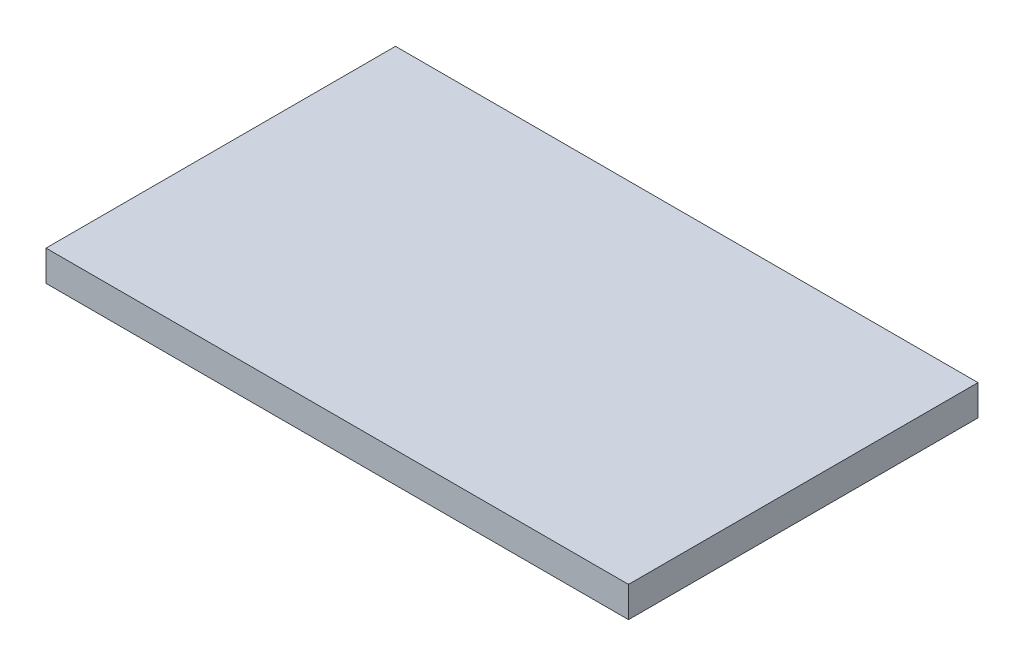
ISO-10303-21;
HEADER;
FILE_DESCRIPTION(('STEP AP214'),'2;1');
FILE_NAME('part.step','',(''),(''),'','','');
FILE_SCHEMA(('AUTOMOTIVE_DESIGN { 1 0 10303 214 1 1 1 1 }'));
ENDSEC;
DATA;
#1=APPLICATION_CONTEXT('core data for automotive mechanical design processes');
#2=APPLICATION_PROTOCOL_DEFINITION('international standard','automotive_design',2000,#1);
#3=PRODUCT_CONTEXT('',#1,'mechanical');
#4=PRODUCT('Part','Part','',(#3));
#5=PRODUCT_RELATED_PRODUCT_CATEGORY('part','',(#4));
#6=PRODUCT_DEFINITION_FORMATION('','',#4);
#7=PRODUCT_DEFINITION_CONTEXT('part definition',#1,'design');
#8=PRODUCT_DEFINITION('design','',#6,#7);
#9=PRODUCT_DEFINITION_SHAPE('','',#8);
#10=(LENGTH_UNIT() NAMED_UNIT(*) SI_UNIT(.MILLI.,.METRE.));
#11=(NAMED_UNIT(*) PLANE_ANGLE_UNIT() SI_UNIT($,.RADIAN.));
#12=(NAMED_UNIT(*) SI_UNIT($,.STERADIAN.) SOLID_ANGLE_UNIT());
#13=UNCERTAINTY_MEASURE_WITH_UNIT(LENGTH_MEASURE(1.E-05),#10,'distance_accuracy_value','');
#14=(GEOMETRIC_REPRESENTATION_CONTEXT(3) GLOBAL_UNCERTAINTY_ASSIGNED_CONTEXT((#13)) GLOBAL_UNIT_ASSIGNED_CONTEXT((#10,
#11,#12)) REPRESENTATION_CONTEXT('',''));
#15=CARTESIAN_POINT('',(0.,0.,0.));
#16=DIRECTION('',(0.,0.,1.));
#17=DIRECTION('',(1.,0.,0.));
#18=AXIS2_PLACEMENT_3D('',#15,#16,#17);
#19=CARTESIAN_POINT('',(0.,2.,0.));
#20=DIRECTION('',(-1.,0.,0.));
#21=DIRECTION('',(0.,0.,1.));
#22=AXIS2_PLACEMENT_3D('',#19,#20,#21);
#23=PLANE('',#22);
#24=DIRECTION('',(0.,0.,-1.));
#25=VECTOR('',#24,1.);
#26=CARTESIAN_POINT('',(0.,0.,0.));
#27=LINE('',#26,#25);
#28=CARTESIAN_POINT('',(0.,0.,0.));
#29=VERTEX_POINT('',#28);
#30=CARTESIAN_POINT('',(0.,0.,-22.86));
#31=VERTEX_POINT('',#30);
#32=EDGE_CURVE('E95',#29,#31,#27,.T.);
#33=ORIENTED_EDGE('',*,*,#32,.T.);
#34=DIRECTION('',(0.,-1.,0.));
#35=VECTOR('',#34,1.);
#36=CARTESIAN_POINT('',(0.,2.,-22.86));
#37=LINE('',#36,#35);
#38=CARTESIAN_POINT('',(0.,2.,-22.86));
#39=VERTEX_POINT('',#38);
#40=EDGE_CURVE('E11',#39,#31,#37,.T.);
#41=ORIENTED_EDGE('',*,*,#40,.F.);
#42=DIRECTION('',(0.,0.,-1.));
#43=VECTOR('',#42,1.);
#44=CARTESIAN_POINT('',(0.,2.,0.));
#45=LINE('',#44,#43);
#46=CARTESIAN_POINT('',(0.,2.,0.));
#47=VERTEX_POINT('',#46);
#48=EDGE_CURVE('E83',#47,#39,#45,.T.);
#49=ORIENTED_EDGE('',*,*,#48,.F.);
#50=DIRECTION('',(0.,-1.,0.));
#51=VECTOR('',#50,1.);
#52=CARTESIAN_POINT('',(0.,2.,0.));
#53=LINE('',#52,#51);
#54=EDGE_CURVE('E91',#47,#29,#53,.T.);
#55=ORIENTED_EDGE('',*,*,#54,.T.);
#56=EDGE_LOOP('',(#33,#41,#49,#55));
#57=FACE_BOUND('',#56,.T.);
#58=ADVANCED_FACE('F32',(#57),#23,.F.);
#59=CARTESIAN_POINT('',(0.,2.,-22.86));
#60=DIRECTION('',(0.,0.,1.));
#61=DIRECTION('',(1.,0.,0.));
#62=AXIS2_PLACEMENT_3D('',#59,#60,#61);
#63=PLANE('',#62);
#64=DIRECTION('',(-1.,0.,0.));
#65=VECTOR('',#64,1.);
#66=CARTESIAN_POINT('',(0.,0.,-22.86));
#67=LINE('',#66,#65);
#68=CARTESIAN_POINT('',(-38.1,0.,-22.86));
#69=VERTEX_POINT('',#68);
#70=EDGE_CURVE('E87',#31,#69,#67,.T.);
#71=ORIENTED_EDGE('',*,*,#70,.T.);
#72=DIRECTION('',(0.,-1.,0.));
#73=VECTOR('',#72,1.);
#74=CARTESIAN_POINT('',(-38.1,2.,-22.86));
#75=LINE('',#74,#73);
#76=CARTESIAN_POINT('',(-38.1,2.,-22.86));
#77=VERTEX_POINT('',#76);
#78=EDGE_CURVE('E40',#77,#69,#75,.T.);
#79=ORIENTED_EDGE('',*,*,#78,.F.);
#80=DIRECTION('',(-1.,0.,0.));
#81=VECTOR('',#80,1.);
#82=CARTESIAN_POINT('',(0.,2.,-22.86));
#83=LINE('',#82,#81);
#84=EDGE_CURVE('E78',#39,#77,#83,.T.);
#85=ORIENTED_EDGE('',*,*,#84,.F.);
#86=ORIENTED_EDGE('',*,*,#40,.T.);
#87=EDGE_LOOP('',(#71,#79,#85,#86));
#88=FACE_BOUND('',#87,.T.);
#89=ADVANCED_FACE('F86',(#88),#63,.F.);
#90=CARTESIAN_POINT('',(-38.1,2.,0.));
#91=DIRECTION('',(1.,0.,0.));
#92=DIRECTION('',(0.,0.,-1.));
#93=AXIS2_PLACEMENT_3D('',#90,#91,#92);
#94=PLANE('',#93);
#95=DIRECTION('',(0.,0.,1.));
#96=VECTOR('',#95,1.);
#97=CARTESIAN_POINT('',(-38.1,0.,0.));
#98=LINE('',#97,#96);
#99=CARTESIAN_POINT('',(-38.1,0.,0.));
#100=VERTEX_POINT('',#99);
#101=EDGE_CURVE('E65',#69,#100,#98,.T.);
#102=ORIENTED_EDGE('',*,*,#101,.T.);
#103=DIRECTION('',(0.,-1.,0.));
#104=VECTOR('',#103,1.);
#105=CARTESIAN_POINT('',(-38.1,2.,0.));
#106=LINE('',#105,#104);
#107=CARTESIAN_POINT('',(-38.1,2.,0.));
#108=VERTEX_POINT('',#107);
#109=EDGE_CURVE('E88',#108,#100,#106,.T.);
#110=ORIENTED_EDGE('',*,*,#109,.F.);
#111=DIRECTION('',(0.,0.,1.));
#112=VECTOR('',#111,1.);
#113=CARTESIAN_POINT('',(-38.1,2.,0.));
#114=LINE('',#113,#112);
#115=EDGE_CURVE('E81',#77,#108,#114,.T.);
#116=ORIENTED_EDGE('',*,*,#115,.F.);
#117=ORIENTED_EDGE('',*,*,#78,.T.);
#118=EDGE_LOOP('',(#102,#110,#116,#117));
#119=FACE_BOUND('',#118,.T.);
#120=ADVANCED_FACE('F89',(#119),#94,.F.);
#121=CARTESIAN_POINT('',(0.,2.,0.));
#122=DIRECTION('',(0.,0.,-1.));
#123=DIRECTION('',(-1.,0.,0.));
#124=AXIS2_PLACEMENT_3D('',#121,#122,#123);
#125=PLANE('',#124);
#126=DIRECTION('',(1.,0.,0.));
#127=VECTOR('',#126,1.);
#128=CARTESIAN_POINT('',(0.,0.,0.));
#129=LINE('',#128,#127);
#130=EDGE_CURVE('E71',#100,#29,#129,.T.);
#131=ORIENTED_EDGE('',*,*,#130,.T.);
#132=ORIENTED_EDGE('',*,*,#54,.F.);
#133=DIRECTION('',(1.,0.,0.));
#134=VECTOR('',#133,1.);
#135=CARTESIAN_POINT('',(0.,2.,0.));
#136=LINE('',#135,#134);
#137=EDGE_CURVE('E48',#108,#47,#136,.T.);
#138=ORIENTED_EDGE('',*,*,#137,.F.);
#139=ORIENTED_EDGE('',*,*,#109,.T.);
#140=EDGE_LOOP('',(#131,#132,#138,#139));
#141=FACE_BOUND('',#140,.T.);
#142=ADVANCED_FACE('F102',(#141),#125,.F.);
#143=CARTESIAN_POINT('',(0.,2.,0.));
#144=DIRECTION('',(0.,1.,0.));
#145=DIRECTION('',(0.,0.,1.));
#146=AXIS2_PLACEMENT_3D('',#143,#144,#145);
#147=PLANE('',#146);
#148=ORIENTED_EDGE('',*,*,#48,.T.);
#149=ORIENTED_EDGE('',*,*,#84,.T.);
#150=ORIENTED_EDGE('',*,*,#115,.T.);
#151=ORIENTED_EDGE('',*,*,#137,.T.);
#152=EDGE_LOOP('',(#148,#149,#150,#151));
#153=FACE_BOUND('',#152,.T.);
#154=ADVANCED_FACE('F79',(#153),#147,.T.);
#155=CARTESIAN_POINT('',(0.,0.,0.));
#156=DIRECTION('',(0.,1.,0.));
#157=DIRECTION('',(0.,0.,1.));
#158=AXIS2_PLACEMENT_3D('',#155,#156,#157);
#159=PLANE('',#158);
#160=ORIENTED_EDGE('',*,*,#32,.F.);
#161=ORIENTED_EDGE('',*,*,#130,.F.);
#162=ORIENTED_EDGE('',*,*,#101,.F.);
#163=ORIENTED_EDGE('',*,*,#70,.F.);
#164=EDGE_LOOP('',(#160,#161,#162,#163));
#165=FACE_BOUND('',#164,.T.);
#166=ADVANCED_FACE('F105',(#165),#159,.F.);
#167=CLOSED_SHELL('',(#58,#89,#120,#142,#154,#166));
#168=MANIFOLD_SOLID_BREP('B2',#167);
#169=ADVANCED_BREP_SHAPE_REPRESENTATION('',(#18,#168),#14);
#170=SHAPE_DEFINITION_REPRESENTATION(#9,#169);
ENDSEC;
END-ISO-10303-21;
